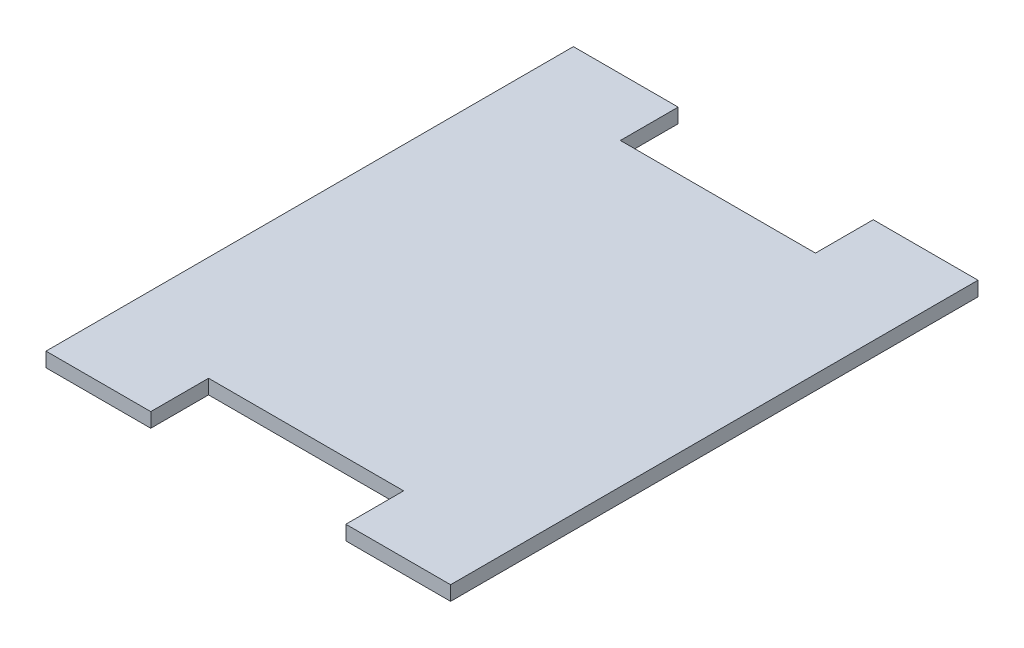
ISO-10303-21;
HEADER;
FILE_DESCRIPTION(('STEP AP214'),'2;1');
FILE_NAME('part.step','',(''),(''),'','','');
FILE_SCHEMA(('AUTOMOTIVE_DESIGN { 1 0 10303 214 1 1 1 1 }'));
ENDSEC;
DATA;
#1=APPLICATION_CONTEXT('core data for automotive mechanical design processes');
#2=APPLICATION_PROTOCOL_DEFINITION('international standard','automotive_design',2000,#1);
#3=PRODUCT_CONTEXT('',#1,'mechanical');
#4=PRODUCT('Part','Part','',(#3));
#5=PRODUCT_RELATED_PRODUCT_CATEGORY('part','',(#4));
#6=PRODUCT_DEFINITION_FORMATION('','',#4);
#7=PRODUCT_DEFINITION_CONTEXT('part definition',#1,'design');
#8=PRODUCT_DEFINITION('design','',#6,#7);
#9=PRODUCT_DEFINITION_SHAPE('','',#8);
#10=(LENGTH_UNIT() NAMED_UNIT(*) SI_UNIT(.MILLI.,.METRE.));
#11=(NAMED_UNIT(*) PLANE_ANGLE_UNIT() SI_UNIT($,.RADIAN.));
#12=(NAMED_UNIT(*) SI_UNIT($,.STERADIAN.) SOLID_ANGLE_UNIT());
#13=UNCERTAINTY_MEASURE_WITH_UNIT(LENGTH_MEASURE(1.E-05),#10,'distance_accuracy_value','');
#14=(GEOMETRIC_REPRESENTATION_CONTEXT(3) GLOBAL_UNCERTAINTY_ASSIGNED_CONTEXT((#13)) GLOBAL_UNIT_ASSIGNED_CONTEXT((#10,
#11,#12)) REPRESENTATION_CONTEXT('',''));
#15=CARTESIAN_POINT('',(0.,0.,0.));
#16=DIRECTION('',(0.,0.,1.));
#17=DIRECTION('',(1.,0.,0.));
#18=AXIS2_PLACEMENT_3D('',#15,#16,#17);
#19=CARTESIAN_POINT('',(-13.5,2.,-36.044776119403));
#20=DIRECTION('',(-1.,0.,0.));
#21=DIRECTION('',(0.,0.,1.));
#22=AXIS2_PLACEMENT_3D('',#19,#20,#21);
#23=PLANE('',#22);
#24=DIRECTION('',(0.,0.,-1.));
#25=VECTOR('',#24,1.);
#26=CARTESIAN_POINT('',(-13.5,0.,-36.044776119403));
#27=LINE('',#26,#25);
#28=CARTESIAN_POINT('',(-13.5,0.,-36.044776119403));
#29=VERTEX_POINT('',#28);
#30=CARTESIAN_POINT('',(-13.5,0.,-44.044776119403));
#31=VERTEX_POINT('',#30);
#32=EDGE_CURVE('E164',#29,#31,#27,.T.);
#33=ORIENTED_EDGE('',*,*,#32,.T.);
#34=DIRECTION('',(0.,-1.,0.));
#35=VECTOR('',#34,1.);
#36=CARTESIAN_POINT('',(-13.5,2.,-44.044776119403));
#37=LINE('',#36,#35);
#38=CARTESIAN_POINT('',(-13.5,2.,-44.044776119403));
#39=VERTEX_POINT('',#38);
#40=EDGE_CURVE('E11',#39,#31,#37,.T.);
#41=ORIENTED_EDGE('',*,*,#40,.F.);
#42=DIRECTION('',(0.,0.,-1.));
#43=VECTOR('',#42,1.);
#44=CARTESIAN_POINT('',(-13.5,2.,-36.044776119403));
#45=LINE('',#44,#43);
#46=CARTESIAN_POINT('',(-13.5,2.,-36.044776119403));
#47=VERTEX_POINT('',#46);
#48=EDGE_CURVE('E198',#47,#39,#45,.T.);
#49=ORIENTED_EDGE('',*,*,#48,.F.);
#50=DIRECTION('',(0.,-1.,0.));
#51=VECTOR('',#50,1.);
#52=CARTESIAN_POINT('',(-13.5,2.,-36.044776119403));
#53=LINE('',#52,#51);
#54=EDGE_CURVE('E160',#47,#29,#53,.T.);
#55=ORIENTED_EDGE('',*,*,#54,.T.);
#56=EDGE_LOOP('',(#33,#41,#49,#55));
#57=FACE_BOUND('',#56,.T.);
#58=ADVANCED_FACE('F39',(#57),#23,.F.);
#59=CARTESIAN_POINT('',(-13.5,2.,-44.044776119403));
#60=DIRECTION('',(0.,0.,1.));
#61=DIRECTION('',(1.,0.,0.));
#62=AXIS2_PLACEMENT_3D('',#59,#60,#61);
#63=PLANE('',#62);
#64=DIRECTION('',(-1.,0.,0.));
#65=VECTOR('',#64,1.);
#66=CARTESIAN_POINT('',(-13.5,0.,-44.044776119403));
#67=LINE('',#66,#65);
#68=CARTESIAN_POINT('',(-28.,0.,-44.044776119403));
#69=VERTEX_POINT('',#68);
#70=EDGE_CURVE('E168',#31,#69,#67,.T.);
#71=ORIENTED_EDGE('',*,*,#70,.T.);
#72=DIRECTION('',(0.,-1.,0.));
#73=VECTOR('',#72,1.);
#74=CARTESIAN_POINT('',(-28.,2.,-44.044776119403));
#75=LINE('',#74,#73);
#76=CARTESIAN_POINT('',(-28.,2.,-44.044776119403));
#77=VERTEX_POINT('',#76);
#78=EDGE_CURVE('E48',#77,#69,#75,.T.);
#79=ORIENTED_EDGE('',*,*,#78,.F.);
#80=DIRECTION('',(-1.,0.,0.));
#81=VECTOR('',#80,1.);
#82=CARTESIAN_POINT('',(-13.5,2.,-44.044776119403));
#83=LINE('',#82,#81);
#84=EDGE_CURVE('E111',#39,#77,#83,.T.);
#85=ORIENTED_EDGE('',*,*,#84,.F.);
#86=ORIENTED_EDGE('',*,*,#40,.T.);
#87=EDGE_LOOP('',(#71,#79,#85,#86));
#88=FACE_BOUND('',#87,.T.);
#89=ADVANCED_FACE('F292',(#88),#63,.F.);
#90=CARTESIAN_POINT('',(-28.,2.,-44.044776119403));
#91=DIRECTION('',(1.,0.,0.));
#92=DIRECTION('',(0.,0.,-1.));
#93=AXIS2_PLACEMENT_3D('',#90,#91,#92);
#94=PLANE('',#93);
#95=DIRECTION('',(0.,0.,1.));
#96=VECTOR('',#95,1.);
#97=CARTESIAN_POINT('',(-28.,0.,-44.044776119403));
#98=LINE('',#97,#96);
#99=CARTESIAN_POINT('',(-28.,0.,28.955223880597));
#100=VERTEX_POINT('',#99);
#101=EDGE_CURVE('E171',#69,#100,#98,.T.);
#102=ORIENTED_EDGE('',*,*,#101,.T.);
#103=DIRECTION('',(0.,-1.,0.));
#104=VECTOR('',#103,1.);
#105=CARTESIAN_POINT('',(-28.,2.,28.955223880597));
#106=LINE('',#105,#104);
#107=CARTESIAN_POINT('',(-28.,2.,28.955223880597));
#108=VERTEX_POINT('',#107);
#109=EDGE_CURVE('E225',#108,#100,#106,.T.);
#110=ORIENTED_EDGE('',*,*,#109,.F.);
#111=DIRECTION('',(0.,0.,1.));
#112=VECTOR('',#111,1.);
#113=CARTESIAN_POINT('',(-28.,2.,-44.044776119403));
#114=LINE('',#113,#112);
#115=EDGE_CURVE('E235',#77,#108,#114,.T.);
#116=ORIENTED_EDGE('',*,*,#115,.F.);
#117=ORIENTED_EDGE('',*,*,#78,.T.);
#118=EDGE_LOOP('',(#102,#110,#116,#117));
#119=FACE_BOUND('',#118,.T.);
#120=ADVANCED_FACE('F233',(#119),#94,.F.);
#121=CARTESIAN_POINT('',(-28.,2.,28.955223880597));
#122=DIRECTION('',(0.,0.,-1.));
#123=DIRECTION('',(-1.,0.,0.));
#124=AXIS2_PLACEMENT_3D('',#121,#122,#123);
#125=PLANE('',#124);
#126=DIRECTION('',(1.,0.,0.));
#127=VECTOR('',#126,1.);
#128=CARTESIAN_POINT('',(-28.,0.,28.955223880597));
#129=LINE('',#128,#127);
#130=CARTESIAN_POINT('',(-13.5,0.,28.955223880597));
#131=VERTEX_POINT('',#130);
#132=EDGE_CURVE('E174',#100,#131,#129,.T.);
#133=ORIENTED_EDGE('',*,*,#132,.T.);
#134=DIRECTION('',(0.,-1.,0.));
#135=VECTOR('',#134,1.);
#136=CARTESIAN_POINT('',(-13.5,2.,28.955223880597));
#137=LINE('',#136,#135);
#138=CARTESIAN_POINT('',(-13.5,2.,28.955223880597));
#139=VERTEX_POINT('',#138);
#140=EDGE_CURVE('E221',#139,#131,#137,.T.);
#141=ORIENTED_EDGE('',*,*,#140,.F.);
#142=DIRECTION('',(1.,0.,0.));
#143=VECTOR('',#142,1.);
#144=CARTESIAN_POINT('',(-28.,2.,28.955223880597));
#145=LINE('',#144,#143);
#146=EDGE_CURVE('E254',#108,#139,#145,.T.);
#147=ORIENTED_EDGE('',*,*,#146,.F.);
#148=ORIENTED_EDGE('',*,*,#109,.T.);
#149=EDGE_LOOP('',(#133,#141,#147,#148));
#150=FACE_BOUND('',#149,.T.);
#151=ADVANCED_FACE('F244',(#150),#125,.F.);
#152=CARTESIAN_POINT('',(-13.5,2.,28.955223880597));
#153=DIRECTION('',(-1.,0.,0.));
#154=DIRECTION('',(0.,0.,1.));
#155=AXIS2_PLACEMENT_3D('',#152,#153,#154);
#156=PLANE('',#155);
#157=DIRECTION('',(0.,0.,-1.));
#158=VECTOR('',#157,1.);
#159=CARTESIAN_POINT('',(-13.5,0.,28.955223880597));
#160=LINE('',#159,#158);
#161=CARTESIAN_POINT('',(-13.5,0.,20.955223880597));
#162=VERTEX_POINT('',#161);
#163=EDGE_CURVE('E177',#131,#162,#160,.T.);
#164=ORIENTED_EDGE('',*,*,#163,.T.);
#165=DIRECTION('',(0.,-1.,0.));
#166=VECTOR('',#165,1.);
#167=CARTESIAN_POINT('',(-13.5,2.,20.955223880597));
#168=LINE('',#167,#166);
#169=CARTESIAN_POINT('',(-13.5,2.,20.955223880597));
#170=VERTEX_POINT('',#169);
#171=EDGE_CURVE('E217',#170,#162,#168,.T.);
#172=ORIENTED_EDGE('',*,*,#171,.F.);
#173=DIRECTION('',(0.,0.,-1.));
#174=VECTOR('',#173,1.);
#175=CARTESIAN_POINT('',(-13.5,2.,28.955223880597));
#176=LINE('',#175,#174);
#177=EDGE_CURVE('E250',#139,#170,#176,.T.);
#178=ORIENTED_EDGE('',*,*,#177,.F.);
#179=ORIENTED_EDGE('',*,*,#140,.T.);
#180=EDGE_LOOP('',(#164,#172,#178,#179));
#181=FACE_BOUND('',#180,.T.);
#182=ADVANCED_FACE('F248',(#181),#156,.F.);
#183=CARTESIAN_POINT('',(-13.5,2.,20.955223880597));
#184=DIRECTION('',(0.,0.,-1.));
#185=DIRECTION('',(-1.,0.,0.));
#186=AXIS2_PLACEMENT_3D('',#183,#184,#185);
#187=PLANE('',#186);
#188=DIRECTION('',(1.,0.,0.));
#189=VECTOR('',#188,1.);
#190=CARTESIAN_POINT('',(-13.5,0.,20.955223880597));
#191=LINE('',#190,#189);
#192=CARTESIAN_POINT('',(13.5,0.,20.955223880597));
#193=VERTEX_POINT('',#192);
#194=EDGE_CURVE('E180',#162,#193,#191,.T.);
#195=ORIENTED_EDGE('',*,*,#194,.T.);
#196=DIRECTION('',(0.,-1.,0.));
#197=VECTOR('',#196,1.);
#198=CARTESIAN_POINT('',(13.5,2.,20.955223880597));
#199=LINE('',#198,#197);
#200=CARTESIAN_POINT('',(13.5,2.,20.955223880597));
#201=VERTEX_POINT('',#200);
#202=EDGE_CURVE('E213',#201,#193,#199,.T.);
#203=ORIENTED_EDGE('',*,*,#202,.F.);
#204=DIRECTION('',(1.,0.,0.));
#205=VECTOR('',#204,1.);
#206=CARTESIAN_POINT('',(-13.5,2.,20.955223880597));
#207=LINE('',#206,#205);
#208=EDGE_CURVE('E253',#170,#201,#207,.T.);
#209=ORIENTED_EDGE('',*,*,#208,.F.);
#210=ORIENTED_EDGE('',*,*,#171,.T.);
#211=EDGE_LOOP('',(#195,#203,#209,#210));
#212=FACE_BOUND('',#211,.T.);
#213=ADVANCED_FACE('F305',(#212),#187,.F.);
#214=CARTESIAN_POINT('',(13.5,2.,28.955223880597));
#215=DIRECTION('',(1.,0.,0.));
#216=DIRECTION('',(0.,0.,-1.));
#217=AXIS2_PLACEMENT_3D('',#214,#215,#216);
#218=PLANE('',#217);
#219=DIRECTION('',(0.,0.,1.));
#220=VECTOR('',#219,1.);
#221=CARTESIAN_POINT('',(13.5,0.,28.955223880597));
#222=LINE('',#221,#220);
#223=CARTESIAN_POINT('',(13.5,0.,28.955223880597));
#224=VERTEX_POINT('',#223);
#225=EDGE_CURVE('E183',#193,#224,#222,.T.);
#226=ORIENTED_EDGE('',*,*,#225,.T.);
#227=DIRECTION('',(0.,-1.,0.));
#228=VECTOR('',#227,1.);
#229=CARTESIAN_POINT('',(13.5,2.,28.955223880597));
#230=LINE('',#229,#228);
#231=CARTESIAN_POINT('',(13.5,2.,28.955223880597));
#232=VERTEX_POINT('',#231);
#233=EDGE_CURVE('E209',#232,#224,#230,.T.);
#234=ORIENTED_EDGE('',*,*,#233,.F.);
#235=DIRECTION('',(0.,0.,1.));
#236=VECTOR('',#235,1.);
#237=CARTESIAN_POINT('',(13.5,2.,28.955223880597));
#238=LINE('',#237,#236);
#239=EDGE_CURVE('E258',#201,#232,#238,.T.);
#240=ORIENTED_EDGE('',*,*,#239,.F.);
#241=ORIENTED_EDGE('',*,*,#202,.T.);
#242=EDGE_LOOP('',(#226,#234,#240,#241));
#243=FACE_BOUND('',#242,.T.);
#244=ADVANCED_FACE('F308',(#243),#218,.F.);
#245=CARTESIAN_POINT('',(28.,2.,28.955223880597));
#246=DIRECTION('',(0.,0.,-1.));
#247=DIRECTION('',(-1.,0.,0.));
#248=AXIS2_PLACEMENT_3D('',#245,#246,#247);
#249=PLANE('',#248);
#250=DIRECTION('',(1.,0.,0.));
#251=VECTOR('',#250,1.);
#252=CARTESIAN_POINT('',(28.,0.,28.955223880597));
#253=LINE('',#252,#251);
#254=CARTESIAN_POINT('',(28.,0.,28.955223880597));
#255=VERTEX_POINT('',#254);
#256=EDGE_CURVE('E186',#224,#255,#253,.T.);
#257=ORIENTED_EDGE('',*,*,#256,.T.);
#258=DIRECTION('',(0.,-1.,0.));
#259=VECTOR('',#258,1.);
#260=CARTESIAN_POINT('',(28.,2.,28.955223880597));
#261=LINE('',#260,#259);
#262=CARTESIAN_POINT('',(28.,2.,28.955223880597));
#263=VERTEX_POINT('',#262);
#264=EDGE_CURVE('E205',#263,#255,#261,.T.);
#265=ORIENTED_EDGE('',*,*,#264,.F.);
#266=DIRECTION('',(1.,0.,0.));
#267=VECTOR('',#266,1.);
#268=CARTESIAN_POINT('',(28.,2.,28.955223880597));
#269=LINE('',#268,#267);
#270=EDGE_CURVE('E265',#232,#263,#269,.T.);
#271=ORIENTED_EDGE('',*,*,#270,.F.);
#272=ORIENTED_EDGE('',*,*,#233,.T.);
#273=EDGE_LOOP('',(#257,#265,#271,#272));
#274=FACE_BOUND('',#273,.T.);
#275=ADVANCED_FACE('F273',(#274),#249,.F.);
#276=CARTESIAN_POINT('',(28.,2.,-44.044776119403));
#277=DIRECTION('',(-1.,0.,0.));
#278=DIRECTION('',(0.,0.,1.));
#279=AXIS2_PLACEMENT_3D('',#276,#277,#278);
#280=PLANE('',#279);
#281=DIRECTION('',(0.,0.,-1.));
#282=VECTOR('',#281,1.);
#283=CARTESIAN_POINT('',(28.,0.,-44.044776119403));
#284=LINE('',#283,#282);
#285=CARTESIAN_POINT('',(28.,0.,-44.044776119403));
#286=VERTEX_POINT('',#285);
#287=EDGE_CURVE('E189',#255,#286,#284,.T.);
#288=ORIENTED_EDGE('',*,*,#287,.T.);
#289=DIRECTION('',(0.,-1.,0.));
#290=VECTOR('',#289,1.);
#291=CARTESIAN_POINT('',(28.,2.,-44.044776119403));
#292=LINE('',#291,#290);
#293=CARTESIAN_POINT('',(28.,2.,-44.044776119403));
#294=VERTEX_POINT('',#293);
#295=EDGE_CURVE('E153',#294,#286,#292,.T.);
#296=ORIENTED_EDGE('',*,*,#295,.F.);
#297=DIRECTION('',(0.,0.,-1.));
#298=VECTOR('',#297,1.);
#299=CARTESIAN_POINT('',(28.,2.,-44.044776119403));
#300=LINE('',#299,#298);
#301=EDGE_CURVE('E142',#263,#294,#300,.T.);
#302=ORIENTED_EDGE('',*,*,#301,.F.);
#303=ORIENTED_EDGE('',*,*,#264,.T.);
#304=EDGE_LOOP('',(#288,#296,#302,#303));
#305=FACE_BOUND('',#304,.T.);
#306=ADVANCED_FACE('F277',(#305),#280,.F.);
#307=CARTESIAN_POINT('',(13.5,2.,-44.044776119403));
#308=DIRECTION('',(0.,0.,1.));
#309=DIRECTION('',(1.,0.,0.));
#310=AXIS2_PLACEMENT_3D('',#307,#308,#309);
#311=PLANE('',#310);
#312=DIRECTION('',(-1.,0.,0.));
#313=VECTOR('',#312,1.);
#314=CARTESIAN_POINT('',(13.5,0.,-44.044776119403));
#315=LINE('',#314,#313);
#316=CARTESIAN_POINT('',(13.5,0.,-44.044776119403));
#317=VERTEX_POINT('',#316);
#318=EDGE_CURVE('E151',#286,#317,#315,.T.);
#319=ORIENTED_EDGE('',*,*,#318,.T.);
#320=DIRECTION('',(0.,-1.,0.));
#321=VECTOR('',#320,1.);
#322=CARTESIAN_POINT('',(13.5,2.,-44.044776119403));
#323=LINE('',#322,#321);
#324=CARTESIAN_POINT('',(13.5,2.,-44.044776119403));
#325=VERTEX_POINT('',#324);
#326=EDGE_CURVE('E148',#325,#317,#323,.T.);
#327=ORIENTED_EDGE('',*,*,#326,.F.);
#328=DIRECTION('',(-1.,0.,0.));
#329=VECTOR('',#328,1.);
#330=CARTESIAN_POINT('',(13.5,2.,-44.044776119403));
#331=LINE('',#330,#329);
#332=EDGE_CURVE('E136',#294,#325,#331,.T.);
#333=ORIENTED_EDGE('',*,*,#332,.F.);
#334=ORIENTED_EDGE('',*,*,#295,.T.);
#335=EDGE_LOOP('',(#319,#327,#333,#334));
#336=FACE_BOUND('',#335,.T.);
#337=ADVANCED_FACE('F149',(#336),#311,.F.);
#338=CARTESIAN_POINT('',(13.5,2.,-36.044776119403));
#339=DIRECTION('',(1.,0.,0.));
#340=DIRECTION('',(0.,0.,-1.));
#341=AXIS2_PLACEMENT_3D('',#338,#339,#340);
#342=PLANE('',#341);
#343=DIRECTION('',(0.,0.,1.));
#344=VECTOR('',#343,1.);
#345=CARTESIAN_POINT('',(13.5,0.,-36.044776119403));
#346=LINE('',#345,#344);
#347=CARTESIAN_POINT('',(13.5,0.,-36.044776119403));
#348=VERTEX_POINT('',#347);
#349=EDGE_CURVE('E97',#317,#348,#346,.T.);
#350=ORIENTED_EDGE('',*,*,#349,.T.);
#351=DIRECTION('',(0.,-1.,0.));
#352=VECTOR('',#351,1.);
#353=CARTESIAN_POINT('',(13.5,2.,-36.044776119403));
#354=LINE('',#353,#352);
#355=CARTESIAN_POINT('',(13.5,2.,-36.044776119403));
#356=VERTEX_POINT('',#355);
#357=EDGE_CURVE('E154',#356,#348,#354,.T.);
#358=ORIENTED_EDGE('',*,*,#357,.F.);
#359=DIRECTION('',(0.,0.,1.));
#360=VECTOR('',#359,1.);
#361=CARTESIAN_POINT('',(13.5,2.,-36.044776119403));
#362=LINE('',#361,#360);
#363=EDGE_CURVE('E140',#325,#356,#362,.T.);
#364=ORIENTED_EDGE('',*,*,#363,.F.);
#365=ORIENTED_EDGE('',*,*,#326,.T.);
#366=EDGE_LOOP('',(#350,#358,#364,#365));
#367=FACE_BOUND('',#366,.T.);
#368=ADVANCED_FACE('F156',(#367),#342,.F.);
#369=CARTESIAN_POINT('',(13.5,2.,-36.044776119403));
#370=DIRECTION('',(0.,0.,1.));
#371=DIRECTION('',(1.,0.,0.));
#372=AXIS2_PLACEMENT_3D('',#369,#370,#371);
#373=PLANE('',#372);
#374=DIRECTION('',(-1.,0.,0.));
#375=VECTOR('',#374,1.);
#376=CARTESIAN_POINT('',(13.5,0.,-36.044776119403));
#377=LINE('',#376,#375);
#378=EDGE_CURVE('E103',#348,#29,#377,.T.);
#379=ORIENTED_EDGE('',*,*,#378,.T.);
#380=ORIENTED_EDGE('',*,*,#54,.F.);
#381=DIRECTION('',(-1.,0.,0.));
#382=VECTOR('',#381,1.);
#383=CARTESIAN_POINT('',(13.5,2.,-36.044776119403));
#384=LINE('',#383,#382);
#385=EDGE_CURVE('E56',#356,#47,#384,.T.);
#386=ORIENTED_EDGE('',*,*,#385,.F.);
#387=ORIENTED_EDGE('',*,*,#357,.T.);
#388=EDGE_LOOP('',(#379,#380,#386,#387));
#389=FACE_BOUND('',#388,.T.);
#390=ADVANCED_FACE('F281',(#389),#373,.F.);
#391=CARTESIAN_POINT('',(0.,2.,0.));
#392=DIRECTION('',(0.,1.,0.));
#393=DIRECTION('',(0.,0.,1.));
#394=AXIS2_PLACEMENT_3D('',#391,#392,#393);
#395=PLANE('',#394);
#396=ORIENTED_EDGE('',*,*,#48,.T.);
#397=ORIENTED_EDGE('',*,*,#84,.T.);
#398=ORIENTED_EDGE('',*,*,#115,.T.);
#399=ORIENTED_EDGE('',*,*,#146,.T.);
#400=ORIENTED_EDGE('',*,*,#177,.T.);
#401=ORIENTED_EDGE('',*,*,#208,.T.);
#402=ORIENTED_EDGE('',*,*,#239,.T.);
#403=ORIENTED_EDGE('',*,*,#270,.T.);
#404=ORIENTED_EDGE('',*,*,#301,.T.);
#405=ORIENTED_EDGE('',*,*,#332,.T.);
#406=ORIENTED_EDGE('',*,*,#363,.T.);
#407=ORIENTED_EDGE('',*,*,#385,.T.);
#408=EDGE_LOOP('',(#396,#397,#398,#399,#400,#401,#402,#403,#404,#405,#406,#407));
#409=FACE_BOUND('',#408,.T.);
#410=ADVANCED_FACE('F138',(#409),#395,.T.);
#411=CARTESIAN_POINT('',(0.,0.,0.));
#412=DIRECTION('',(0.,1.,0.));
#413=DIRECTION('',(0.,0.,1.));
#414=AXIS2_PLACEMENT_3D('',#411,#412,#413);
#415=PLANE('',#414);
#416=ORIENTED_EDGE('',*,*,#32,.F.);
#417=ORIENTED_EDGE('',*,*,#378,.F.);
#418=ORIENTED_EDGE('',*,*,#349,.F.);
#419=ORIENTED_EDGE('',*,*,#318,.F.);
#420=ORIENTED_EDGE('',*,*,#287,.F.);
#421=ORIENTED_EDGE('',*,*,#256,.F.);
#422=ORIENTED_EDGE('',*,*,#225,.F.);
#423=ORIENTED_EDGE('',*,*,#194,.F.);
#424=ORIENTED_EDGE('',*,*,#163,.F.);
#425=ORIENTED_EDGE('',*,*,#132,.F.);
#426=ORIENTED_EDGE('',*,*,#101,.F.);
#427=ORIENTED_EDGE('',*,*,#70,.F.);
#428=EDGE_LOOP('',(#416,#417,#418,#419,#420,#421,#422,#423,#424,#425,#426,#427));
#429=FACE_BOUND('',#428,.T.);
#430=ADVANCED_FACE('F239',(#429),#415,.F.);
#431=CLOSED_SHELL('',(#58,#89,#120,#151,#182,#213,#244,#275,#306,#337,#368,#390,#410,#430));
#432=MANIFOLD_SOLID_BREP('B2',#431);
#433=ADVANCED_BREP_SHAPE_REPRESENTATION('',(#18,#432),#14);
#434=SHAPE_DEFINITION_REPRESENTATION(#9,#433);
ENDSEC;
END-ISO-10303-21;
